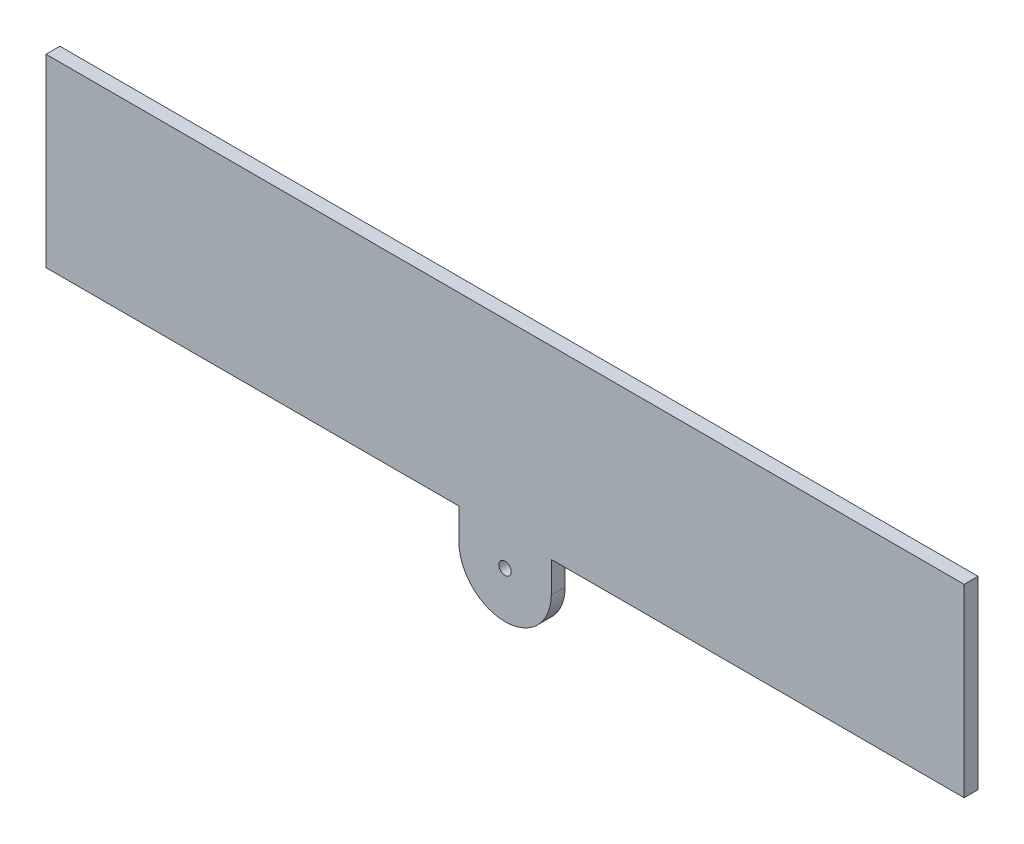
ISO-10303-21;
HEADER;
FILE_DESCRIPTION(('STEP AP214'),'2;1');
FILE_NAME('part.step','',(''),(''),'','','');
FILE_SCHEMA(('AUTOMOTIVE_DESIGN { 1 0 10303 214 1 1 1 1 }'));
ENDSEC;
DATA;
#1=APPLICATION_CONTEXT('core data for automotive mechanical design processes');
#2=APPLICATION_PROTOCOL_DEFINITION('international standard','automotive_design',2000,#1);
#3=PRODUCT_CONTEXT('',#1,'mechanical');
#4=PRODUCT('Part','Part','',(#3));
#5=PRODUCT_RELATED_PRODUCT_CATEGORY('part','',(#4));
#6=PRODUCT_DEFINITION_FORMATION('','',#4);
#7=PRODUCT_DEFINITION_CONTEXT('part definition',#1,'design');
#8=PRODUCT_DEFINITION('design','',#6,#7);
#9=PRODUCT_DEFINITION_SHAPE('','',#8);
#10=(LENGTH_UNIT() NAMED_UNIT(*) SI_UNIT(.MILLI.,.METRE.));
#11=(NAMED_UNIT(*) PLANE_ANGLE_UNIT() SI_UNIT($,.RADIAN.));
#12=(NAMED_UNIT(*) SI_UNIT($,.STERADIAN.) SOLID_ANGLE_UNIT());
#13=UNCERTAINTY_MEASURE_WITH_UNIT(LENGTH_MEASURE(1.E-05),#10,'distance_accuracy_value','');
#14=(GEOMETRIC_REPRESENTATION_CONTEXT(3) GLOBAL_UNCERTAINTY_ASSIGNED_CONTEXT((#13)) GLOBAL_UNIT_ASSIGNED_CONTEXT((#10,
#11,#12)) REPRESENTATION_CONTEXT('',''));
#15=CARTESIAN_POINT('',(0.,0.,0.));
#16=DIRECTION('',(0.,0.,1.));
#17=DIRECTION('',(1.,0.,0.));
#18=AXIS2_PLACEMENT_3D('',#15,#16,#17);
#19=CARTESIAN_POINT('',(-37.846,-7.62,1.143));
#20=DIRECTION('',(0.,1.,0.));
#21=DIRECTION('',(0.,0.,1.));
#22=AXIS2_PLACEMENT_3D('',#19,#20,#21);
#23=PLANE('',#22);
#24=DIRECTION('',(0.,0.,1.));
#25=VECTOR('',#24,1.);
#26=CARTESIAN_POINT('',(3.81,-7.62,-9.91901708840145));
#27=LINE('',#26,#25);
#28=CARTESIAN_POINT('',(3.81,-7.62,0.));
#29=VERTEX_POINT('',#28);
#30=CARTESIAN_POINT('',(3.81,-7.62,1.143));
#31=VERTEX_POINT('',#30);
#32=EDGE_CURVE('E69',#29,#31,#27,.T.);
#33=ORIENTED_EDGE('',*,*,#32,.F.);
#34=DIRECTION('',(1.,0.,0.));
#35=VECTOR('',#34,1.);
#36=CARTESIAN_POINT('',(-37.846,-7.62,0.));
#37=LINE('',#36,#35);
#38=CARTESIAN_POINT('',(37.846,-7.62,0.));
#39=VERTEX_POINT('',#38);
#40=EDGE_CURVE('E185',#29,#39,#37,.T.);
#41=ORIENTED_EDGE('',*,*,#40,.T.);
#42=DIRECTION('',(0.,0.,-1.));
#43=VECTOR('',#42,1.);
#44=CARTESIAN_POINT('',(37.846,-7.62,1.143));
#45=LINE('',#44,#43);
#46=CARTESIAN_POINT('',(37.846,-7.62,1.143));
#47=VERTEX_POINT('',#46);
#48=EDGE_CURVE('E175',#47,#39,#45,.T.);
#49=ORIENTED_EDGE('',*,*,#48,.F.);
#50=DIRECTION('',(1.,0.,0.));
#51=VECTOR('',#50,1.);
#52=CARTESIAN_POINT('',(-37.846,-7.62,1.143));
#53=LINE('',#52,#51);
#54=EDGE_CURVE('E172',#31,#47,#53,.T.);
#55=ORIENTED_EDGE('',*,*,#54,.F.);
#56=EDGE_LOOP('',(#33,#41,#49,#55));
#57=FACE_BOUND('',#56,.T.);
#58=ADVANCED_FACE('F45',(#57),#23,.F.);
#59=CARTESIAN_POINT('',(37.846,7.62,1.143));
#60=DIRECTION('',(-1.,0.,0.));
#61=DIRECTION('',(0.,-1.,0.));
#62=AXIS2_PLACEMENT_3D('',#59,#60,#61);
#63=PLANE('',#62);
#64=DIRECTION('',(0.,1.,0.));
#65=VECTOR('',#64,1.);
#66=CARTESIAN_POINT('',(37.846,7.62,0.));
#67=LINE('',#66,#65);
#68=CARTESIAN_POINT('',(37.846,7.62,0.));
#69=VERTEX_POINT('',#68);
#70=EDGE_CURVE('E160',#39,#69,#67,.T.);
#71=ORIENTED_EDGE('',*,*,#70,.T.);
#72=DIRECTION('',(0.,0.,-1.));
#73=VECTOR('',#72,1.);
#74=CARTESIAN_POINT('',(37.846,7.62,1.143));
#75=LINE('',#74,#73);
#76=CARTESIAN_POINT('',(37.846,7.62,1.143));
#77=VERTEX_POINT('',#76);
#78=EDGE_CURVE('E11',#77,#69,#75,.T.);
#79=ORIENTED_EDGE('',*,*,#78,.F.);
#80=DIRECTION('',(0.,1.,0.));
#81=VECTOR('',#80,1.);
#82=CARTESIAN_POINT('',(37.846,7.62,1.143));
#83=LINE('',#82,#81);
#84=EDGE_CURVE('E162',#47,#77,#83,.T.);
#85=ORIENTED_EDGE('',*,*,#84,.F.);
#86=ORIENTED_EDGE('',*,*,#48,.T.);
#87=EDGE_LOOP('',(#71,#79,#85,#86));
#88=FACE_BOUND('',#87,.T.);
#89=ADVANCED_FACE('F47',(#88),#63,.F.);
#90=CARTESIAN_POINT('',(-37.846,7.62,1.143));
#91=DIRECTION('',(0.,-1.,0.));
#92=DIRECTION('',(0.,0.,-1.));
#93=AXIS2_PLACEMENT_3D('',#90,#91,#92);
#94=PLANE('',#93);
#95=DIRECTION('',(-1.,0.,0.));
#96=VECTOR('',#95,1.);
#97=CARTESIAN_POINT('',(-37.846,7.62,0.));
#98=LINE('',#97,#96);
#99=CARTESIAN_POINT('',(-37.846,7.62,0.));
#100=VERTEX_POINT('',#99);
#101=EDGE_CURVE('E179',#69,#100,#98,.T.);
#102=ORIENTED_EDGE('',*,*,#101,.T.);
#103=DIRECTION('',(0.,0.,-1.));
#104=VECTOR('',#103,1.);
#105=CARTESIAN_POINT('',(-37.846,7.62,1.143));
#106=LINE('',#105,#104);
#107=CARTESIAN_POINT('',(-37.846,7.62,1.143));
#108=VERTEX_POINT('',#107);
#109=EDGE_CURVE('E54',#108,#100,#106,.T.);
#110=ORIENTED_EDGE('',*,*,#109,.F.);
#111=DIRECTION('',(-1.,0.,0.));
#112=VECTOR('',#111,1.);
#113=CARTESIAN_POINT('',(-37.846,7.62,1.143));
#114=LINE('',#113,#112);
#115=EDGE_CURVE('E165',#77,#108,#114,.T.);
#116=ORIENTED_EDGE('',*,*,#115,.F.);
#117=ORIENTED_EDGE('',*,*,#78,.T.);
#118=EDGE_LOOP('',(#102,#110,#116,#117));
#119=FACE_BOUND('',#118,.T.);
#120=ADVANCED_FACE('F217',(#119),#94,.F.);
#121=CARTESIAN_POINT('',(-37.846,7.62,1.143));
#122=DIRECTION('',(1.,0.,0.));
#123=DIRECTION('',(0.,0.,-1.));
#124=AXIS2_PLACEMENT_3D('',#121,#122,#123);
#125=PLANE('',#124);
#126=DIRECTION('',(0.,-1.,0.));
#127=VECTOR('',#126,1.);
#128=CARTESIAN_POINT('',(-37.846,7.62,0.));
#129=LINE('',#128,#127);
#130=CARTESIAN_POINT('',(-37.846,-7.62,0.));
#131=VERTEX_POINT('',#130);
#132=EDGE_CURVE('E182',#100,#131,#129,.T.);
#133=ORIENTED_EDGE('',*,*,#132,.T.);
#134=DIRECTION('',(0.,0.,-1.));
#135=VECTOR('',#134,1.);
#136=CARTESIAN_POINT('',(-37.846,-7.62,1.143));
#137=LINE('',#136,#135);
#138=CARTESIAN_POINT('',(-37.846,-7.62,1.143));
#139=VERTEX_POINT('',#138);
#140=EDGE_CURVE('E191',#139,#131,#137,.T.);
#141=ORIENTED_EDGE('',*,*,#140,.F.);
#142=DIRECTION('',(0.,-1.,0.));
#143=VECTOR('',#142,1.);
#144=CARTESIAN_POINT('',(-37.846,7.62,1.143));
#145=LINE('',#144,#143);
#146=EDGE_CURVE('E169',#108,#139,#145,.T.);
#147=ORIENTED_EDGE('',*,*,#146,.F.);
#148=ORIENTED_EDGE('',*,*,#109,.T.);
#149=EDGE_LOOP('',(#133,#141,#147,#148));
#150=FACE_BOUND('',#149,.T.);
#151=ADVANCED_FACE('F200',(#150),#125,.F.);
#152=CARTESIAN_POINT('',(-3.80999999999999,-7.62,0.));
#153=VERTEX_POINT('',#152);
#154=EDGE_CURVE('E166',#131,#153,#37,.T.);
#155=ORIENTED_EDGE('',*,*,#154,.T.);
#156=DIRECTION('',(0.,0.,1.));
#157=VECTOR('',#156,1.);
#158=CARTESIAN_POINT('',(-3.81,-7.62,-9.91901708840145));
#159=LINE('',#158,#157);
#160=CARTESIAN_POINT('',(-3.80999999999999,-7.62,1.143));
#161=VERTEX_POINT('',#160);
#162=EDGE_CURVE('E61',#153,#161,#159,.T.);
#163=ORIENTED_EDGE('',*,*,#162,.T.);
#164=EDGE_CURVE('E138',#139,#161,#53,.T.);
#165=ORIENTED_EDGE('',*,*,#164,.F.);
#166=ORIENTED_EDGE('',*,*,#140,.T.);
#167=EDGE_LOOP('',(#155,#163,#165,#166));
#168=FACE_BOUND('',#167,.T.);
#169=ADVANCED_FACE('F208',(#168),#23,.F.);
#170=CARTESIAN_POINT('',(0.,0.,1.143));
#171=DIRECTION('',(0.,0.,1.));
#172=DIRECTION('',(1.,0.,0.));
#173=AXIS2_PLACEMENT_3D('',#170,#171,#172);
#174=PLANE('',#173);
#175=ORIENTED_EDGE('',*,*,#84,.T.);
#176=ORIENTED_EDGE('',*,*,#115,.T.);
#177=ORIENTED_EDGE('',*,*,#146,.T.);
#178=ORIENTED_EDGE('',*,*,#164,.T.);
#179=DIRECTION('',(0.,-1.,0.));
#180=VECTOR('',#179,1.);
#181=CARTESIAN_POINT('',(-3.81,-7.62,1.143));
#182=LINE('',#181,#180);
#183=CARTESIAN_POINT('',(-3.81,-10.16,1.143));
#184=VERTEX_POINT('',#183);
#185=EDGE_CURVE('E117',#161,#184,#182,.T.);
#186=ORIENTED_EDGE('',*,*,#185,.T.);
#187=CARTESIAN_POINT('',(0.,-10.16,1.143));
#188=DIRECTION('',(0.,0.,1.));
#189=DIRECTION('',(1.,0.,0.));
#190=AXIS2_PLACEMENT_3D('',#187,#188,#189);
#191=CIRCLE('',#190,3.81);
#192=CARTESIAN_POINT('',(3.81,-10.16,1.143));
#193=VERTEX_POINT('',#192);
#194=EDGE_CURVE('E127',#184,#193,#191,.T.);
#195=ORIENTED_EDGE('',*,*,#194,.T.);
#196=DIRECTION('',(0.,1.,0.));
#197=VECTOR('',#196,1.);
#198=CARTESIAN_POINT('',(3.81,-7.62,1.143));
#199=LINE('',#198,#197);
#200=EDGE_CURVE('E124',#193,#31,#199,.T.);
#201=ORIENTED_EDGE('',*,*,#200,.T.);
#202=ORIENTED_EDGE('',*,*,#54,.T.);
#203=EDGE_LOOP('',(#175,#176,#177,#178,#186,#195,#201,#202));
#204=FACE_BOUND('',#203,.T.);
#205=CARTESIAN_POINT('',(0.,-10.16,1.143));
#206=DIRECTION('',(0.,0.,1.));
#207=DIRECTION('',(1.,0.,0.));
#208=AXIS2_PLACEMENT_3D('',#205,#206,#207);
#209=CIRCLE('',#208,0.507999999999999);
#210=CARTESIAN_POINT('',(0.507999999999999,-10.16,1.143));
#211=VERTEX_POINT('',#210);
#212=EDGE_CURVE('E140',#211,#211,#209,.T.);
#213=ORIENTED_EDGE('',*,*,#212,.F.);
#214=EDGE_LOOP('',(#213));
#215=FACE_BOUND('',#214,.T.);
#216=ADVANCED_FACE('F136',(#204,#215),#174,.T.);
#217=CARTESIAN_POINT('',(0.,0.,0.));
#218=DIRECTION('',(0.,0.,1.));
#219=DIRECTION('',(1.,0.,0.));
#220=AXIS2_PLACEMENT_3D('',#217,#218,#219);
#221=PLANE('',#220);
#222=ORIENTED_EDGE('',*,*,#70,.F.);
#223=ORIENTED_EDGE('',*,*,#40,.F.);
#224=DIRECTION('',(0.,-1.,0.));
#225=VECTOR('',#224,1.);
#226=CARTESIAN_POINT('',(3.81,-7.62,0.));
#227=LINE('',#226,#225);
#228=CARTESIAN_POINT('',(3.81,-10.16,0.));
#229=VERTEX_POINT('',#228);
#230=EDGE_CURVE('E151',#29,#229,#227,.T.);
#231=ORIENTED_EDGE('',*,*,#230,.T.);
#232=CARTESIAN_POINT('',(0.,-10.16,0.));
#233=DIRECTION('',(0.,0.,1.));
#234=DIRECTION('',(1.,0.,0.));
#235=AXIS2_PLACEMENT_3D('',#232,#233,#234);
#236=CIRCLE('',#235,3.81);
#237=CARTESIAN_POINT('',(-3.81,-10.16,0.));
#238=VERTEX_POINT('',#237);
#239=EDGE_CURVE('E161',#229,#238,#236,.F.);
#240=ORIENTED_EDGE('',*,*,#239,.T.);
#241=DIRECTION('',(0.,1.,0.));
#242=VECTOR('',#241,1.);
#243=CARTESIAN_POINT('',(-3.81,-7.62,0.));
#244=LINE('',#243,#242);
#245=EDGE_CURVE('E119',#238,#153,#244,.T.);
#246=ORIENTED_EDGE('',*,*,#245,.T.);
#247=ORIENTED_EDGE('',*,*,#154,.F.);
#248=ORIENTED_EDGE('',*,*,#132,.F.);
#249=ORIENTED_EDGE('',*,*,#101,.F.);
#250=EDGE_LOOP('',(#222,#223,#231,#240,#246,#247,#248,#249));
#251=FACE_BOUND('',#250,.T.);
#252=CARTESIAN_POINT('',(0.,-10.16,0.));
#253=DIRECTION('',(0.,0.,1.));
#254=DIRECTION('',(1.,0.,0.));
#255=AXIS2_PLACEMENT_3D('',#252,#253,#254);
#256=CIRCLE('',#255,0.507999999999999);
#257=CARTESIAN_POINT('',(0.507999999999999,-10.16,0.));
#258=VERTEX_POINT('',#257);
#259=EDGE_CURVE('E156',#258,#258,#256,.F.);
#260=ORIENTED_EDGE('',*,*,#259,.F.);
#261=EDGE_LOOP('',(#260));
#262=FACE_BOUND('',#261,.T.);
#263=ADVANCED_FACE('F206',(#251,#262),#221,.F.);
#264=CARTESIAN_POINT('',(0.,-10.16,-9.91901708840145));
#265=DIRECTION('',(0.,0.,1.));
#266=DIRECTION('',(1.,0.,0.));
#267=AXIS2_PLACEMENT_3D('',#264,#265,#266);
#268=CYLINDRICAL_SURFACE('',#267,3.81);
#269=ORIENTED_EDGE('',*,*,#239,.F.);
#270=DIRECTION('',(0.,0.,1.));
#271=VECTOR('',#270,1.);
#272=CARTESIAN_POINT('',(3.81,-10.16,-9.91901708840145));
#273=LINE('',#272,#271);
#274=EDGE_CURVE('E123',#229,#193,#273,.T.);
#275=ORIENTED_EDGE('',*,*,#274,.T.);
#276=ORIENTED_EDGE('',*,*,#194,.F.);
#277=DIRECTION('',(0.,0.,1.));
#278=VECTOR('',#277,1.);
#279=CARTESIAN_POINT('',(-3.81,-10.16,-9.91901708840145));
#280=LINE('',#279,#278);
#281=EDGE_CURVE('E113',#238,#184,#280,.T.);
#282=ORIENTED_EDGE('',*,*,#281,.F.);
#283=EDGE_LOOP('',(#269,#275,#276,#282));
#284=FACE_BOUND('',#283,.T.);
#285=ADVANCED_FACE('F128',(#284),#268,.T.);
#286=CARTESIAN_POINT('',(3.81,-7.62,-9.91901708840145));
#287=DIRECTION('',(1.,0.,0.));
#288=DIRECTION('',(0.,1.,0.));
#289=AXIS2_PLACEMENT_3D('',#286,#287,#288);
#290=PLANE('',#289);
#291=ORIENTED_EDGE('',*,*,#230,.F.);
#292=ORIENTED_EDGE('',*,*,#32,.T.);
#293=ORIENTED_EDGE('',*,*,#200,.F.);
#294=ORIENTED_EDGE('',*,*,#274,.F.);
#295=EDGE_LOOP('',(#291,#292,#293,#294));
#296=FACE_BOUND('',#295,.T.);
#297=ADVANCED_FACE('F233',(#296),#290,.T.);
#298=CARTESIAN_POINT('',(-3.81,-7.62,-9.91901708840145));
#299=DIRECTION('',(-1.,0.,0.));
#300=DIRECTION('',(0.,-1.,0.));
#301=AXIS2_PLACEMENT_3D('',#298,#299,#300);
#302=PLANE('',#301);
#303=ORIENTED_EDGE('',*,*,#245,.F.);
#304=ORIENTED_EDGE('',*,*,#281,.T.);
#305=ORIENTED_EDGE('',*,*,#185,.F.);
#306=ORIENTED_EDGE('',*,*,#162,.F.);
#307=EDGE_LOOP('',(#303,#304,#305,#306));
#308=FACE_BOUND('',#307,.T.);
#309=ADVANCED_FACE('F115',(#308),#302,.T.);
#310=CARTESIAN_POINT('',(0.,-10.16,-9.91901708840145));
#311=DIRECTION('',(0.,0.,1.));
#312=DIRECTION('',(1.,0.,0.));
#313=AXIS2_PLACEMENT_3D('',#310,#311,#312);
#314=CYLINDRICAL_SURFACE('',#313,0.507999999999999);
#315=ORIENTED_EDGE('',*,*,#259,.T.);
#316=EDGE_LOOP('',(#315));
#317=FACE_BOUND('',#316,.T.);
#318=ORIENTED_EDGE('',*,*,#212,.T.);
#319=EDGE_LOOP('',(#318));
#320=FACE_BOUND('',#319,.T.);
#321=ADVANCED_FACE('F246',(#317,#320),#314,.F.);
#322=CLOSED_SHELL('',(#58,#89,#120,#151,#169,#216,#263,#285,#297,#309,#321));
#323=MANIFOLD_SOLID_BREP('B2',#322);
#324=ADVANCED_BREP_SHAPE_REPRESENTATION('',(#18,#323),#14);
#325=SHAPE_DEFINITION_REPRESENTATION(#9,#324);
ENDSEC;
END-ISO-10303-21;
